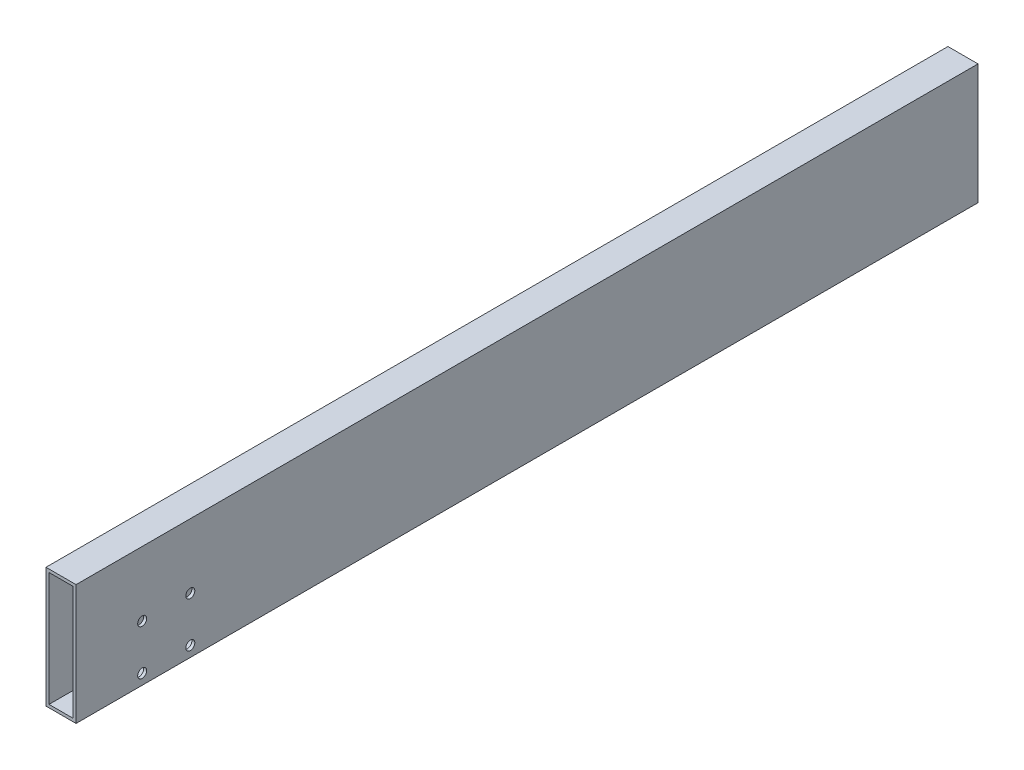
ISO-10303-21;
HEADER;
FILE_DESCRIPTION(('STEP AP214'),'2;1');
FILE_NAME('part.step','',(''),(''),'','','');
FILE_SCHEMA(('AUTOMOTIVE_DESIGN { 1 0 10303 214 1 1 1 1 }'));
ENDSEC;
DATA;
#1=APPLICATION_CONTEXT('core data for automotive mechanical design processes');
#2=APPLICATION_PROTOCOL_DEFINITION('international standard','automotive_design',2000,#1);
#3=PRODUCT_CONTEXT('',#1,'mechanical');
#4=PRODUCT('Part','Part','',(#3));
#5=PRODUCT_RELATED_PRODUCT_CATEGORY('part','',(#4));
#6=PRODUCT_DEFINITION_FORMATION('','',#4);
#7=PRODUCT_DEFINITION_CONTEXT('part definition',#1,'design');
#8=PRODUCT_DEFINITION('design','',#6,#7);
#9=PRODUCT_DEFINITION_SHAPE('','',#8);
#10=(LENGTH_UNIT() NAMED_UNIT(*) SI_UNIT(.MILLI.,.METRE.));
#11=(NAMED_UNIT(*) PLANE_ANGLE_UNIT() SI_UNIT($,.RADIAN.));
#12=(NAMED_UNIT(*) SI_UNIT($,.STERADIAN.) SOLID_ANGLE_UNIT());
#13=UNCERTAINTY_MEASURE_WITH_UNIT(LENGTH_MEASURE(1.E-05),#10,'distance_accuracy_value','');
#14=(GEOMETRIC_REPRESENTATION_CONTEXT(3) GLOBAL_UNCERTAINTY_ASSIGNED_CONTEXT((#13)) GLOBAL_UNIT_ASSIGNED_CONTEXT((#10,
#11,#12)) REPRESENTATION_CONTEXT('',''));
#15=CARTESIAN_POINT('',(0.,0.,0.));
#16=DIRECTION('',(0.,0.,1.));
#17=DIRECTION('',(1.,0.,0.));
#18=AXIS2_PLACEMENT_3D('',#15,#16,#17);
#19=CARTESIAN_POINT('',(0.,0.,300.));
#20=DIRECTION('',(0.,0.,-1.));
#21=DIRECTION('',(-1.,0.,0.));
#22=AXIS2_PLACEMENT_3D('',#19,#20,#21);
#23=PLANE('',#22);
#24=DIRECTION('',(0.,-1.,0.));
#25=VECTOR('',#24,1.);
#26=CARTESIAN_POINT('',(0.,0.,300.));
#27=LINE('',#26,#25);
#28=CARTESIAN_POINT('',(0.,40.,300.));
#29=VERTEX_POINT('',#28);
#30=CARTESIAN_POINT('',(0.,0.,300.));
#31=VERTEX_POINT('',#30);
#32=EDGE_CURVE('E140',#29,#31,#27,.T.);
#33=ORIENTED_EDGE('',*,*,#32,.T.);
#34=DIRECTION('',(1.,0.,0.));
#35=VECTOR('',#34,1.);
#36=CARTESIAN_POINT('',(0.,0.,300.));
#37=LINE('',#36,#35);
#38=CARTESIAN_POINT('',(10.,0.,300.));
#39=VERTEX_POINT('',#38);
#40=EDGE_CURVE('E143',#31,#39,#37,.T.);
#41=ORIENTED_EDGE('',*,*,#40,.T.);
#42=DIRECTION('',(0.,1.,0.));
#43=VECTOR('',#42,1.);
#44=CARTESIAN_POINT('',(10.,0.,300.));
#45=LINE('',#44,#43);
#46=CARTESIAN_POINT('',(10.,40.,300.));
#47=VERTEX_POINT('',#46);
#48=EDGE_CURVE('E146',#39,#47,#45,.T.);
#49=ORIENTED_EDGE('',*,*,#48,.T.);
#50=DIRECTION('',(-1.,0.,0.));
#51=VECTOR('',#50,1.);
#52=CARTESIAN_POINT('',(0.,40.,300.));
#53=LINE('',#52,#51);
#54=EDGE_CURVE('E148',#47,#29,#53,.T.);
#55=ORIENTED_EDGE('',*,*,#54,.T.);
#56=EDGE_LOOP('',(#33,#41,#49,#55));
#57=FACE_BOUND('',#56,.T.);
#58=DIRECTION('',(0.,-1.,0.));
#59=VECTOR('',#58,1.);
#60=CARTESIAN_POINT('',(1.,1.,300.));
#61=LINE('',#60,#59);
#62=CARTESIAN_POINT('',(1.,39.,300.));
#63=VERTEX_POINT('',#62);
#64=CARTESIAN_POINT('',(1.,1.,300.));
#65=VERTEX_POINT('',#64);
#66=EDGE_CURVE('E102',#63,#65,#61,.T.);
#67=ORIENTED_EDGE('',*,*,#66,.F.);
#68=DIRECTION('',(-1.,0.,0.));
#69=VECTOR('',#68,1.);
#70=CARTESIAN_POINT('',(1.,39.,300.));
#71=LINE('',#70,#69);
#72=CARTESIAN_POINT('',(9.,39.,300.));
#73=VERTEX_POINT('',#72);
#74=EDGE_CURVE('E124',#73,#63,#71,.T.);
#75=ORIENTED_EDGE('',*,*,#74,.F.);
#76=DIRECTION('',(0.,1.,0.));
#77=VECTOR('',#76,1.);
#78=CARTESIAN_POINT('',(9.,1.,300.));
#79=LINE('',#78,#77);
#80=CARTESIAN_POINT('',(9.,1.,300.));
#81=VERTEX_POINT('',#80);
#82=EDGE_CURVE('E122',#81,#73,#79,.T.);
#83=ORIENTED_EDGE('',*,*,#82,.F.);
#84=DIRECTION('',(1.,0.,0.));
#85=VECTOR('',#84,1.);
#86=CARTESIAN_POINT('',(1.,1.,300.));
#87=LINE('',#86,#85);
#88=EDGE_CURVE('E110',#65,#81,#87,.T.);
#89=ORIENTED_EDGE('',*,*,#88,.F.);
#90=EDGE_LOOP('',(#67,#75,#83,#89));
#91=FACE_BOUND('',#90,.T.);
#92=ADVANCED_FACE('F35',(#57,#91),#23,.F.);
#93=CARTESIAN_POINT('',(0.,0.,0.));
#94=DIRECTION('',(0.,0.,-1.));
#95=DIRECTION('',(-1.,0.,0.));
#96=AXIS2_PLACEMENT_3D('',#93,#94,#95);
#97=PLANE('',#96);
#98=DIRECTION('',(0.,-1.,0.));
#99=VECTOR('',#98,1.);
#100=CARTESIAN_POINT('',(0.,0.,0.));
#101=LINE('',#100,#99);
#102=CARTESIAN_POINT('',(0.,40.,0.));
#103=VERTEX_POINT('',#102);
#104=CARTESIAN_POINT('',(0.,0.,0.));
#105=VERTEX_POINT('',#104);
#106=EDGE_CURVE('E118',#103,#105,#101,.T.);
#107=ORIENTED_EDGE('',*,*,#106,.F.);
#108=DIRECTION('',(-1.,0.,0.));
#109=VECTOR('',#108,1.);
#110=CARTESIAN_POINT('',(0.,40.,0.));
#111=LINE('',#110,#109);
#112=CARTESIAN_POINT('',(10.,40.,0.));
#113=VERTEX_POINT('',#112);
#114=EDGE_CURVE('E144',#113,#103,#111,.T.);
#115=ORIENTED_EDGE('',*,*,#114,.F.);
#116=DIRECTION('',(0.,1.,0.));
#117=VECTOR('',#116,1.);
#118=CARTESIAN_POINT('',(10.,0.,0.));
#119=LINE('',#118,#117);
#120=CARTESIAN_POINT('',(10.,0.,0.));
#121=VERTEX_POINT('',#120);
#122=EDGE_CURVE('E155',#121,#113,#119,.T.);
#123=ORIENTED_EDGE('',*,*,#122,.F.);
#124=DIRECTION('',(1.,0.,0.));
#125=VECTOR('',#124,1.);
#126=CARTESIAN_POINT('',(0.,0.,0.));
#127=LINE('',#126,#125);
#128=EDGE_CURVE('E153',#105,#121,#127,.T.);
#129=ORIENTED_EDGE('',*,*,#128,.F.);
#130=EDGE_LOOP('',(#107,#115,#123,#129));
#131=FACE_BOUND('',#130,.T.);
#132=DIRECTION('',(-1.,0.,0.));
#133=VECTOR('',#132,1.);
#134=CARTESIAN_POINT('',(1.,39.,0.));
#135=LINE('',#134,#133);
#136=CARTESIAN_POINT('',(9.,39.,0.));
#137=VERTEX_POINT('',#136);
#138=CARTESIAN_POINT('',(1.,39.,0.));
#139=VERTEX_POINT('',#138);
#140=EDGE_CURVE('E111',#137,#139,#135,.T.);
#141=ORIENTED_EDGE('',*,*,#140,.T.);
#142=DIRECTION('',(0.,-1.,0.));
#143=VECTOR('',#142,1.);
#144=CARTESIAN_POINT('',(1.,1.,0.));
#145=LINE('',#144,#143);
#146=CARTESIAN_POINT('',(1.,1.,0.));
#147=VERTEX_POINT('',#146);
#148=EDGE_CURVE('E60',#139,#147,#145,.T.);
#149=ORIENTED_EDGE('',*,*,#148,.T.);
#150=DIRECTION('',(1.,0.,0.));
#151=VECTOR('',#150,1.);
#152=CARTESIAN_POINT('',(1.,1.,0.));
#153=LINE('',#152,#151);
#154=CARTESIAN_POINT('',(9.,1.,0.));
#155=VERTEX_POINT('',#154);
#156=EDGE_CURVE('E117',#147,#155,#153,.T.);
#157=ORIENTED_EDGE('',*,*,#156,.T.);
#158=DIRECTION('',(0.,1.,0.));
#159=VECTOR('',#158,1.);
#160=CARTESIAN_POINT('',(9.,1.,0.));
#161=LINE('',#160,#159);
#162=EDGE_CURVE('E132',#155,#137,#161,.T.);
#163=ORIENTED_EDGE('',*,*,#162,.T.);
#164=EDGE_LOOP('',(#141,#149,#157,#163));
#165=FACE_BOUND('',#164,.T.);
#166=ADVANCED_FACE('F207',(#131,#165),#97,.T.);
#167=CARTESIAN_POINT('',(0.,0.,300.));
#168=DIRECTION('',(1.,0.,0.));
#169=DIRECTION('',(0.,0.,-1.));
#170=AXIS2_PLACEMENT_3D('',#167,#168,#169);
#171=PLANE('',#170);
#172=CARTESIAN_POINT('',(0.,3.5,278.));
#173=DIRECTION('',(1.,0.,0.));
#174=DIRECTION('',(0.,0.,-1.));
#175=AXIS2_PLACEMENT_3D('',#172,#173,#174);
#176=CIRCLE('',#175,1.50000000000002);
#177=CARTESIAN_POINT('',(0.,3.5,276.5));
#178=VERTEX_POINT('',#177);
#179=EDGE_CURVE('E260',#178,#178,#176,.T.);
#180=ORIENTED_EDGE('',*,*,#179,.T.);
#181=EDGE_LOOP('',(#180));
#182=FACE_BOUND('',#181,.T.);
#183=CARTESIAN_POINT('',(0.,18.5,262.));
#184=DIRECTION('',(1.,0.,0.));
#185=DIRECTION('',(0.,0.,-1.));
#186=AXIS2_PLACEMENT_3D('',#183,#184,#185);
#187=CIRCLE('',#186,1.50000000000002);
#188=CARTESIAN_POINT('',(0.,18.5,260.5));
#189=VERTEX_POINT('',#188);
#190=EDGE_CURVE('E264',#189,#189,#187,.T.);
#191=ORIENTED_EDGE('',*,*,#190,.T.);
#192=EDGE_LOOP('',(#191));
#193=FACE_BOUND('',#192,.T.);
#194=CARTESIAN_POINT('',(0.,3.5,262.));
#195=DIRECTION('',(1.,0.,0.));
#196=DIRECTION('',(0.,0.,-1.));
#197=AXIS2_PLACEMENT_3D('',#194,#195,#196);
#198=CIRCLE('',#197,1.50000000000002);
#199=CARTESIAN_POINT('',(0.,3.5,260.5));
#200=VERTEX_POINT('',#199);
#201=EDGE_CURVE('E268',#200,#200,#198,.T.);
#202=ORIENTED_EDGE('',*,*,#201,.T.);
#203=EDGE_LOOP('',(#202));
#204=FACE_BOUND('',#203,.T.);
#205=CARTESIAN_POINT('',(0.,18.5,278.));
#206=DIRECTION('',(1.,0.,0.));
#207=DIRECTION('',(0.,0.,-1.));
#208=AXIS2_PLACEMENT_3D('',#205,#206,#207);
#209=CIRCLE('',#208,1.50000000000002);
#210=CARTESIAN_POINT('',(0.,18.5,276.5));
#211=VERTEX_POINT('',#210);
#212=EDGE_CURVE('E169',#211,#211,#209,.T.);
#213=ORIENTED_EDGE('',*,*,#212,.T.);
#214=EDGE_LOOP('',(#213));
#215=FACE_BOUND('',#214,.T.);
#216=ORIENTED_EDGE('',*,*,#106,.T.);
#217=DIRECTION('',(0.,0.,-1.));
#218=VECTOR('',#217,1.);
#219=CARTESIAN_POINT('',(0.,0.,300.));
#220=LINE('',#219,#218);
#221=EDGE_CURVE('E11',#31,#105,#220,.T.);
#222=ORIENTED_EDGE('',*,*,#221,.F.);
#223=ORIENTED_EDGE('',*,*,#32,.F.);
#224=DIRECTION('',(0.,0.,-1.));
#225=VECTOR('',#224,1.);
#226=CARTESIAN_POINT('',(0.,40.,300.));
#227=LINE('',#226,#225);
#228=EDGE_CURVE('E150',#29,#103,#227,.T.);
#229=ORIENTED_EDGE('',*,*,#228,.T.);
#230=EDGE_LOOP('',(#216,#222,#223,#229));
#231=FACE_BOUND('',#230,.T.);
#232=ADVANCED_FACE('F37',(#182,#193,#204,#215,#231),#171,.F.);
#233=CARTESIAN_POINT('',(0.,0.,300.));
#234=DIRECTION('',(0.,1.,0.));
#235=DIRECTION('',(0.,0.,1.));
#236=AXIS2_PLACEMENT_3D('',#233,#234,#235);
#237=PLANE('',#236);
#238=ORIENTED_EDGE('',*,*,#128,.T.);
#239=DIRECTION('',(0.,0.,-1.));
#240=VECTOR('',#239,1.);
#241=CARTESIAN_POINT('',(10.,0.,300.));
#242=LINE('',#241,#240);
#243=EDGE_CURVE('E44',#39,#121,#242,.T.);
#244=ORIENTED_EDGE('',*,*,#243,.F.);
#245=ORIENTED_EDGE('',*,*,#40,.F.);
#246=ORIENTED_EDGE('',*,*,#221,.T.);
#247=EDGE_LOOP('',(#238,#244,#245,#246));
#248=FACE_BOUND('',#247,.T.);
#249=ADVANCED_FACE('F235',(#248),#237,.F.);
#250=CARTESIAN_POINT('',(10.,0.,300.));
#251=DIRECTION('',(-1.,0.,0.));
#252=DIRECTION('',(0.,0.,1.));
#253=AXIS2_PLACEMENT_3D('',#250,#251,#252);
#254=PLANE('',#253);
#255=CARTESIAN_POINT('',(10.,3.5,278.));
#256=DIRECTION('',(1.,0.,0.));
#257=DIRECTION('',(0.,0.,-1.));
#258=AXIS2_PLACEMENT_3D('',#255,#256,#257);
#259=CIRCLE('',#258,1.50000000000002);
#260=CARTESIAN_POINT('',(10.,3.5,276.5));
#261=VERTEX_POINT('',#260);
#262=EDGE_CURVE('E276',#261,#261,#259,.T.);
#263=ORIENTED_EDGE('',*,*,#262,.F.);
#264=EDGE_LOOP('',(#263));
#265=FACE_BOUND('',#264,.T.);
#266=CARTESIAN_POINT('',(10.,18.5,262.));
#267=DIRECTION('',(1.,0.,0.));
#268=DIRECTION('',(0.,0.,-1.));
#269=AXIS2_PLACEMENT_3D('',#266,#267,#268);
#270=CIRCLE('',#269,1.50000000000002);
#271=CARTESIAN_POINT('',(10.,18.5,260.5));
#272=VERTEX_POINT('',#271);
#273=EDGE_CURVE('E280',#272,#272,#270,.T.);
#274=ORIENTED_EDGE('',*,*,#273,.F.);
#275=EDGE_LOOP('',(#274));
#276=FACE_BOUND('',#275,.T.);
#277=CARTESIAN_POINT('',(10.,3.5,262.));
#278=DIRECTION('',(1.,0.,0.));
#279=DIRECTION('',(0.,0.,-1.));
#280=AXIS2_PLACEMENT_3D('',#277,#278,#279);
#281=CIRCLE('',#280,1.50000000000002);
#282=CARTESIAN_POINT('',(10.,3.5,260.5));
#283=VERTEX_POINT('',#282);
#284=EDGE_CURVE('E284',#283,#283,#281,.T.);
#285=ORIENTED_EDGE('',*,*,#284,.F.);
#286=EDGE_LOOP('',(#285));
#287=FACE_BOUND('',#286,.T.);
#288=CARTESIAN_POINT('',(10.,18.5,278.));
#289=DIRECTION('',(1.,0.,0.));
#290=DIRECTION('',(0.,0.,-1.));
#291=AXIS2_PLACEMENT_3D('',#288,#289,#290);
#292=CIRCLE('',#291,1.50000000000002);
#293=CARTESIAN_POINT('',(10.,18.5,276.5));
#294=VERTEX_POINT('',#293);
#295=EDGE_CURVE('E272',#294,#294,#292,.T.);
#296=ORIENTED_EDGE('',*,*,#295,.F.);
#297=EDGE_LOOP('',(#296));
#298=FACE_BOUND('',#297,.T.);
#299=ORIENTED_EDGE('',*,*,#122,.T.);
#300=DIRECTION('',(0.,0.,-1.));
#301=VECTOR('',#300,1.);
#302=CARTESIAN_POINT('',(10.,40.,300.));
#303=LINE('',#302,#301);
#304=EDGE_CURVE('E160',#47,#113,#303,.T.);
#305=ORIENTED_EDGE('',*,*,#304,.F.);
#306=ORIENTED_EDGE('',*,*,#48,.F.);
#307=ORIENTED_EDGE('',*,*,#243,.T.);
#308=EDGE_LOOP('',(#299,#305,#306,#307));
#309=FACE_BOUND('',#308,.T.);
#310=ADVANCED_FACE('F232',(#265,#276,#287,#298,#309),#254,.F.);
#311=CARTESIAN_POINT('',(0.,40.,300.));
#312=DIRECTION('',(0.,-1.,0.));
#313=DIRECTION('',(0.,0.,-1.));
#314=AXIS2_PLACEMENT_3D('',#311,#312,#313);
#315=PLANE('',#314);
#316=ORIENTED_EDGE('',*,*,#114,.T.);
#317=ORIENTED_EDGE('',*,*,#228,.F.);
#318=ORIENTED_EDGE('',*,*,#54,.F.);
#319=ORIENTED_EDGE('',*,*,#304,.T.);
#320=EDGE_LOOP('',(#316,#317,#318,#319));
#321=FACE_BOUND('',#320,.T.);
#322=ADVANCED_FACE('F229',(#321),#315,.F.);
#323=CARTESIAN_POINT('',(1.,1.,300.));
#324=DIRECTION('',(1.,0.,0.));
#325=DIRECTION('',(0.,0.,-1.));
#326=AXIS2_PLACEMENT_3D('',#323,#324,#325);
#327=PLANE('',#326);
#328=CARTESIAN_POINT('',(1.,3.5,278.));
#329=DIRECTION('',(1.,0.,0.));
#330=DIRECTION('',(0.,0.,-1.));
#331=AXIS2_PLACEMENT_3D('',#328,#329,#330);
#332=CIRCLE('',#331,1.50000000000002);
#333=CARTESIAN_POINT('',(1.,3.5,276.5));
#334=VERTEX_POINT('',#333);
#335=EDGE_CURVE('E130',#334,#334,#332,.T.);
#336=ORIENTED_EDGE('',*,*,#335,.F.);
#337=EDGE_LOOP('',(#336));
#338=FACE_BOUND('',#337,.T.);
#339=CARTESIAN_POINT('',(1.,18.5,262.));
#340=DIRECTION('',(1.,0.,0.));
#341=DIRECTION('',(0.,0.,-1.));
#342=AXIS2_PLACEMENT_3D('',#339,#340,#341);
#343=CIRCLE('',#342,1.50000000000002);
#344=CARTESIAN_POINT('',(1.,18.5,260.5));
#345=VERTEX_POINT('',#344);
#346=EDGE_CURVE('E175',#345,#345,#343,.T.);
#347=ORIENTED_EDGE('',*,*,#346,.F.);
#348=EDGE_LOOP('',(#347));
#349=FACE_BOUND('',#348,.T.);
#350=CARTESIAN_POINT('',(1.,3.5,262.));
#351=DIRECTION('',(1.,0.,0.));
#352=DIRECTION('',(0.,0.,-1.));
#353=AXIS2_PLACEMENT_3D('',#350,#351,#352);
#354=CIRCLE('',#353,1.50000000000002);
#355=CARTESIAN_POINT('',(1.,3.5,260.5));
#356=VERTEX_POINT('',#355);
#357=EDGE_CURVE('E172',#356,#356,#354,.T.);
#358=ORIENTED_EDGE('',*,*,#357,.F.);
#359=EDGE_LOOP('',(#358));
#360=FACE_BOUND('',#359,.T.);
#361=CARTESIAN_POINT('',(1.,18.5,278.));
#362=DIRECTION('',(1.,0.,0.));
#363=DIRECTION('',(0.,0.,-1.));
#364=AXIS2_PLACEMENT_3D('',#361,#362,#363);
#365=CIRCLE('',#364,1.50000000000002);
#366=CARTESIAN_POINT('',(1.,18.5,276.5));
#367=VERTEX_POINT('',#366);
#368=EDGE_CURVE('E168',#367,#367,#365,.T.);
#369=ORIENTED_EDGE('',*,*,#368,.F.);
#370=EDGE_LOOP('',(#369));
#371=FACE_BOUND('',#370,.T.);
#372=ORIENTED_EDGE('',*,*,#148,.F.);
#373=DIRECTION('',(0.,0.,-1.));
#374=VECTOR('',#373,1.);
#375=CARTESIAN_POINT('',(1.,39.,300.));
#376=LINE('',#375,#374);
#377=EDGE_CURVE('E106',#63,#139,#376,.T.);
#378=ORIENTED_EDGE('',*,*,#377,.F.);
#379=ORIENTED_EDGE('',*,*,#66,.T.);
#380=DIRECTION('',(0.,0.,-1.));
#381=VECTOR('',#380,1.);
#382=CARTESIAN_POINT('',(1.,1.,300.));
#383=LINE('',#382,#381);
#384=EDGE_CURVE('E105',#65,#147,#383,.T.);
#385=ORIENTED_EDGE('',*,*,#384,.T.);
#386=EDGE_LOOP('',(#372,#378,#379,#385));
#387=FACE_BOUND('',#386,.T.);
#388=ADVANCED_FACE('F104',(#338,#349,#360,#371,#387),#327,.T.);
#389=CARTESIAN_POINT('',(1.,1.,300.));
#390=DIRECTION('',(0.,1.,0.));
#391=DIRECTION('',(0.,0.,1.));
#392=AXIS2_PLACEMENT_3D('',#389,#390,#391);
#393=PLANE('',#392);
#394=ORIENTED_EDGE('',*,*,#156,.F.);
#395=ORIENTED_EDGE('',*,*,#384,.F.);
#396=ORIENTED_EDGE('',*,*,#88,.T.);
#397=DIRECTION('',(0.,0.,-1.));
#398=VECTOR('',#397,1.);
#399=CARTESIAN_POINT('',(9.,1.,300.));
#400=LINE('',#399,#398);
#401=EDGE_CURVE('E119',#81,#155,#400,.T.);
#402=ORIENTED_EDGE('',*,*,#401,.T.);
#403=EDGE_LOOP('',(#394,#395,#396,#402));
#404=FACE_BOUND('',#403,.T.);
#405=ADVANCED_FACE('F114',(#404),#393,.T.);
#406=CARTESIAN_POINT('',(9.,1.,300.));
#407=DIRECTION('',(-1.,0.,0.));
#408=DIRECTION('',(0.,0.,1.));
#409=AXIS2_PLACEMENT_3D('',#406,#407,#408);
#410=PLANE('',#409);
#411=CARTESIAN_POINT('',(9.,3.5,278.));
#412=DIRECTION('',(-1.,0.,0.));
#413=DIRECTION('',(0.,0.,1.));
#414=AXIS2_PLACEMENT_3D('',#411,#412,#413);
#415=CIRCLE('',#414,1.50000000000002);
#416=CARTESIAN_POINT('',(9.,3.5,279.5));
#417=VERTEX_POINT('',#416);
#418=EDGE_CURVE('E39',#417,#417,#415,.T.);
#419=ORIENTED_EDGE('',*,*,#418,.F.);
#420=EDGE_LOOP('',(#419));
#421=FACE_BOUND('',#420,.T.);
#422=CARTESIAN_POINT('',(9.,18.5,262.));
#423=DIRECTION('',(-1.,0.,0.));
#424=DIRECTION('',(0.,0.,1.));
#425=AXIS2_PLACEMENT_3D('',#422,#423,#424);
#426=CIRCLE('',#425,1.50000000000002);
#427=CARTESIAN_POINT('',(9.,18.5,263.5));
#428=VERTEX_POINT('',#427);
#429=EDGE_CURVE('E173',#428,#428,#426,.T.);
#430=ORIENTED_EDGE('',*,*,#429,.F.);
#431=EDGE_LOOP('',(#430));
#432=FACE_BOUND('',#431,.T.);
#433=CARTESIAN_POINT('',(9.,3.5,262.));
#434=DIRECTION('',(-1.,0.,0.));
#435=DIRECTION('',(0.,0.,1.));
#436=AXIS2_PLACEMENT_3D('',#433,#434,#435);
#437=CIRCLE('',#436,1.50000000000002);
#438=CARTESIAN_POINT('',(9.,3.5,263.5));
#439=VERTEX_POINT('',#438);
#440=EDGE_CURVE('E170',#439,#439,#437,.T.);
#441=ORIENTED_EDGE('',*,*,#440,.F.);
#442=EDGE_LOOP('',(#441));
#443=FACE_BOUND('',#442,.T.);
#444=CARTESIAN_POINT('',(9.,18.5,278.));
#445=DIRECTION('',(-1.,0.,0.));
#446=DIRECTION('',(0.,0.,1.));
#447=AXIS2_PLACEMENT_3D('',#444,#445,#446);
#448=CIRCLE('',#447,1.50000000000002);
#449=CARTESIAN_POINT('',(9.,18.5,279.5));
#450=VERTEX_POINT('',#449);
#451=EDGE_CURVE('E165',#450,#450,#448,.T.);
#452=ORIENTED_EDGE('',*,*,#451,.F.);
#453=EDGE_LOOP('',(#452));
#454=FACE_BOUND('',#453,.T.);
#455=ORIENTED_EDGE('',*,*,#162,.F.);
#456=ORIENTED_EDGE('',*,*,#401,.F.);
#457=ORIENTED_EDGE('',*,*,#82,.T.);
#458=DIRECTION('',(0.,0.,-1.));
#459=VECTOR('',#458,1.);
#460=CARTESIAN_POINT('',(9.,39.,300.));
#461=LINE('',#460,#459);
#462=EDGE_CURVE('E52',#73,#137,#461,.T.);
#463=ORIENTED_EDGE('',*,*,#462,.T.);
#464=EDGE_LOOP('',(#455,#456,#457,#463));
#465=FACE_BOUND('',#464,.T.);
#466=ADVANCED_FACE('F195',(#421,#432,#443,#454,#465),#410,.T.);
#467=CARTESIAN_POINT('',(1.,39.,300.));
#468=DIRECTION('',(0.,-1.,0.));
#469=DIRECTION('',(0.,0.,-1.));
#470=AXIS2_PLACEMENT_3D('',#467,#468,#469);
#471=PLANE('',#470);
#472=ORIENTED_EDGE('',*,*,#140,.F.);
#473=ORIENTED_EDGE('',*,*,#462,.F.);
#474=ORIENTED_EDGE('',*,*,#74,.T.);
#475=ORIENTED_EDGE('',*,*,#377,.T.);
#476=EDGE_LOOP('',(#472,#473,#474,#475));
#477=FACE_BOUND('',#476,.T.);
#478=ADVANCED_FACE('F198',(#477),#471,.T.);
#479=CARTESIAN_POINT('',(0.,18.5,278.));
#480=DIRECTION('',(1.,0.,0.));
#481=DIRECTION('',(0.,0.,-1.));
#482=AXIS2_PLACEMENT_3D('',#479,#480,#481);
#483=CYLINDRICAL_SURFACE('',#482,1.50000000000002);
#484=ORIENTED_EDGE('',*,*,#451,.T.);
#485=EDGE_LOOP('',(#484));
#486=FACE_BOUND('',#485,.T.);
#487=ORIENTED_EDGE('',*,*,#295,.T.);
#488=EDGE_LOOP('',(#487));
#489=FACE_BOUND('',#488,.T.);
#490=ADVANCED_FACE('F209',(#486,#489),#483,.F.);
#491=CARTESIAN_POINT('',(0.,3.5,262.));
#492=DIRECTION('',(1.,0.,0.));
#493=DIRECTION('',(0.,0.,-1.));
#494=AXIS2_PLACEMENT_3D('',#491,#492,#493);
#495=CYLINDRICAL_SURFACE('',#494,1.50000000000002);
#496=ORIENTED_EDGE('',*,*,#440,.T.);
#497=EDGE_LOOP('',(#496));
#498=FACE_BOUND('',#497,.T.);
#499=ORIENTED_EDGE('',*,*,#284,.T.);
#500=EDGE_LOOP('',(#499));
#501=FACE_BOUND('',#500,.T.);
#502=ADVANCED_FACE('F214',(#498,#501),#495,.F.);
#503=CARTESIAN_POINT('',(0.,18.5,262.));
#504=DIRECTION('',(1.,0.,0.));
#505=DIRECTION('',(0.,0.,-1.));
#506=AXIS2_PLACEMENT_3D('',#503,#504,#505);
#507=CYLINDRICAL_SURFACE('',#506,1.50000000000002);
#508=ORIENTED_EDGE('',*,*,#429,.T.);
#509=EDGE_LOOP('',(#508));
#510=FACE_BOUND('',#509,.T.);
#511=ORIENTED_EDGE('',*,*,#273,.T.);
#512=EDGE_LOOP('',(#511));
#513=FACE_BOUND('',#512,.T.);
#514=ADVANCED_FACE('F294',(#510,#513),#507,.F.);
#515=CARTESIAN_POINT('',(0.,3.5,278.));
#516=DIRECTION('',(1.,0.,0.));
#517=DIRECTION('',(0.,0.,-1.));
#518=AXIS2_PLACEMENT_3D('',#515,#516,#517);
#519=CYLINDRICAL_SURFACE('',#518,1.50000000000002);
#520=ORIENTED_EDGE('',*,*,#418,.T.);
#521=EDGE_LOOP('',(#520));
#522=FACE_BOUND('',#521,.T.);
#523=ORIENTED_EDGE('',*,*,#262,.T.);
#524=EDGE_LOOP('',(#523));
#525=FACE_BOUND('',#524,.T.);
#526=ADVANCED_FACE('F192',(#522,#525),#519,.F.);
#527=ORIENTED_EDGE('',*,*,#368,.T.);
#528=EDGE_LOOP('',(#527));
#529=FACE_BOUND('',#528,.T.);
#530=ORIENTED_EDGE('',*,*,#212,.F.);
#531=EDGE_LOOP('',(#530));
#532=FACE_BOUND('',#531,.T.);
#533=ADVANCED_FACE('F217',(#529,#532),#483,.F.);
#534=ORIENTED_EDGE('',*,*,#357,.T.);
#535=EDGE_LOOP('',(#534));
#536=FACE_BOUND('',#535,.T.);
#537=ORIENTED_EDGE('',*,*,#201,.F.);
#538=EDGE_LOOP('',(#537));
#539=FACE_BOUND('',#538,.T.);
#540=ADVANCED_FACE('F297',(#536,#539),#495,.F.);
#541=ORIENTED_EDGE('',*,*,#346,.T.);
#542=EDGE_LOOP('',(#541));
#543=FACE_BOUND('',#542,.T.);
#544=ORIENTED_EDGE('',*,*,#190,.F.);
#545=EDGE_LOOP('',(#544));
#546=FACE_BOUND('',#545,.T.);
#547=ADVANCED_FACE('F302',(#543,#546),#507,.F.);
#548=ORIENTED_EDGE('',*,*,#335,.T.);
#549=EDGE_LOOP('',(#548));
#550=FACE_BOUND('',#549,.T.);
#551=ORIENTED_EDGE('',*,*,#179,.F.);
#552=EDGE_LOOP('',(#551));
#553=FACE_BOUND('',#552,.T.);
#554=ADVANCED_FACE('F308',(#550,#553),#519,.F.);
#555=CLOSED_SHELL('',(#92,#166,#232,#249,#310,#322,#388,#405,#466,#478,#490,#502,#514,#526,#533,
#540,#547,#554));
#556=MANIFOLD_SOLID_BREP('B2',#555);
#557=ADVANCED_BREP_SHAPE_REPRESENTATION('',(#18,#556),#14);
#558=SHAPE_DEFINITION_REPRESENTATION(#9,#557);
ENDSEC;
END-ISO-10303-21;
